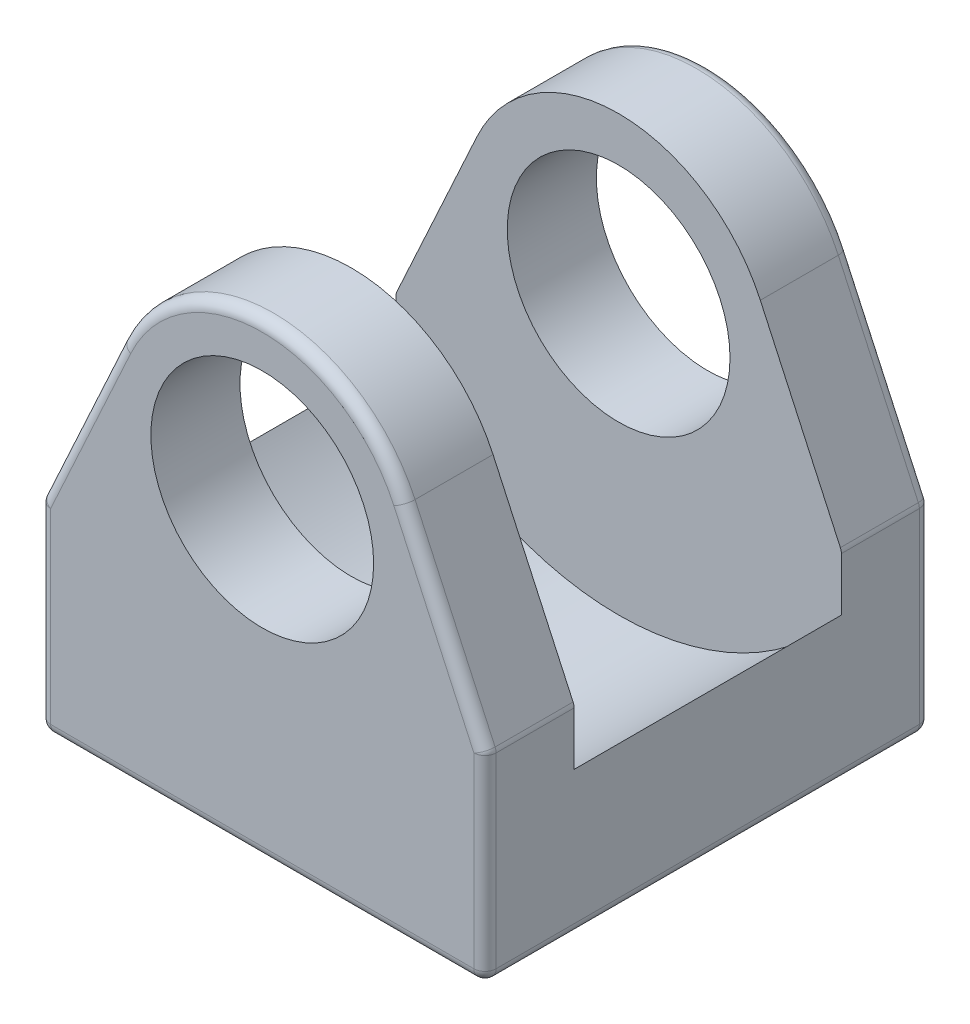
ISO-10303-21;
HEADER;
FILE_DESCRIPTION(('STEP AP214'),'2;1');
FILE_NAME('part.step','',(''),(''),'','','');
FILE_SCHEMA(('AUTOMOTIVE_DESIGN { 1 0 10303 214 1 1 1 1 }'));
ENDSEC;
DATA;
#1=APPLICATION_CONTEXT('core data for automotive mechanical design processes');
#2=APPLICATION_PROTOCOL_DEFINITION('international standard','automotive_design',2000,#1);
#3=PRODUCT_CONTEXT('',#1,'mechanical');
#4=PRODUCT('Part','Part','',(#3));
#5=PRODUCT_RELATED_PRODUCT_CATEGORY('part','',(#4));
#6=PRODUCT_DEFINITION_FORMATION('','',#4);
#7=PRODUCT_DEFINITION_CONTEXT('part definition',#1,'design');
#8=PRODUCT_DEFINITION('design','',#6,#7);
#9=PRODUCT_DEFINITION_SHAPE('','',#8);
#10=(LENGTH_UNIT() NAMED_UNIT(*) SI_UNIT(.MILLI.,.METRE.));
#11=(NAMED_UNIT(*) PLANE_ANGLE_UNIT() SI_UNIT($,.RADIAN.));
#12=(NAMED_UNIT(*) SI_UNIT($,.STERADIAN.) SOLID_ANGLE_UNIT());
#13=UNCERTAINTY_MEASURE_WITH_UNIT(LENGTH_MEASURE(1.E-05),#10,'distance_accuracy_value','');
#14=(GEOMETRIC_REPRESENTATION_CONTEXT(3) GLOBAL_UNCERTAINTY_ASSIGNED_CONTEXT((#13)) GLOBAL_UNIT_ASSIGNED_CONTEXT((#10,
#11,#12)) REPRESENTATION_CONTEXT('',''));
#15=CARTESIAN_POINT('',(0.,0.,0.));
#16=DIRECTION('',(0.,0.,1.));
#17=DIRECTION('',(1.,0.,0.));
#18=AXIS2_PLACEMENT_3D('',#15,#16,#17);
#19=CARTESIAN_POINT('',(10.,4.5,10.));
#20=DIRECTION('',(-1.,0.,0.));
#21=DIRECTION('',(0.,-1.,0.));
#22=AXIS2_PLACEMENT_3D('',#19,#20,#21);
#23=PLANE('',#22);
#24=DIRECTION('',(0.,1.,0.));
#25=VECTOR('',#24,1.);
#26=CARTESIAN_POINT('',(10.,4.5,-6.));
#27=LINE('',#26,#25);
#28=CARTESIAN_POINT('',(10.,1.99999999999999,-6.));
#29=VERTEX_POINT('',#28);
#30=CARTESIAN_POINT('',(10.,4.39065300332114,-6.));
#31=VERTEX_POINT('',#30);
#32=EDGE_CURVE('E243',#29,#31,#27,.T.);
#33=ORIENTED_EDGE('',*,*,#32,.F.);
#34=DIRECTION('',(0.,0.,1.));
#35=VECTOR('',#34,1.);
#36=CARTESIAN_POINT('',(10.,1.99999999999999,-6.));
#37=LINE('',#36,#35);
#38=CARTESIAN_POINT('',(10.,1.99999999999999,6.));
#39=VERTEX_POINT('',#38);
#40=EDGE_CURVE('E248',#29,#39,#37,.T.);
#41=ORIENTED_EDGE('',*,*,#40,.T.);
#42=DIRECTION('',(0.,1.,0.));
#43=VECTOR('',#42,1.);
#44=CARTESIAN_POINT('',(10.,4.5,6.));
#45=LINE('',#44,#43);
#46=CARTESIAN_POINT('',(10.,4.39065300332114,6.));
#47=VERTEX_POINT('',#46);
#48=EDGE_CURVE('E208',#39,#47,#45,.T.);
#49=ORIENTED_EDGE('',*,*,#48,.T.);
#50=DIRECTION('',(0.,0.,-1.));
#51=VECTOR('',#50,1.);
#52=CARTESIAN_POINT('',(10.,4.39065300332114,10.));
#53=LINE('',#52,#51);
#54=CARTESIAN_POINT('',(10.,4.39065300332114,9.5));
#55=VERTEX_POINT('',#54);
#56=EDGE_CURVE('E311',#47,#55,#53,.F.);
#57=ORIENTED_EDGE('',*,*,#56,.T.);
#58=DIRECTION('',(0.,1.,0.));
#59=VECTOR('',#58,1.);
#60=CARTESIAN_POINT('',(10.,-4.5,9.5));
#61=LINE('',#60,#59);
#62=CARTESIAN_POINT('',(10.,-4.,9.5));
#63=VERTEX_POINT('',#62);
#64=EDGE_CURVE('E315',#55,#63,#61,.F.);
#65=ORIENTED_EDGE('',*,*,#64,.T.);
#66=DIRECTION('',(0.,0.,-1.));
#67=VECTOR('',#66,1.);
#68=CARTESIAN_POINT('',(10.,-4.,10.));
#69=LINE('',#68,#67);
#70=CARTESIAN_POINT('',(10.,-4.,-9.5));
#71=VERTEX_POINT('',#70);
#72=EDGE_CURVE('E307',#63,#71,#69,.T.);
#73=ORIENTED_EDGE('',*,*,#72,.T.);
#74=DIRECTION('',(0.,1.,0.));
#75=VECTOR('',#74,1.);
#76=CARTESIAN_POINT('',(10.,4.5,-9.5));
#77=LINE('',#76,#75);
#78=CARTESIAN_POINT('',(10.,4.39065300332114,-9.5));
#79=VERTEX_POINT('',#78);
#80=EDGE_CURVE('E309',#71,#79,#77,.T.);
#81=ORIENTED_EDGE('',*,*,#80,.T.);
#82=EDGE_CURVE('E312',#79,#31,#53,.F.);
#83=ORIENTED_EDGE('',*,*,#82,.T.);
#84=EDGE_LOOP('',(#33,#41,#49,#57,#65,#73,#81,#83));
#85=FACE_BOUND('',#84,.T.);
#86=ADVANCED_FACE('F36',(#85),#23,.F.);
#87=CARTESIAN_POINT('',(6.36098340838278,12.4219668167656,10.));
#88=DIRECTION('',(-0.908711915483254,-0.417423830966507,0.));
#89=DIRECTION('',(0.417423830966507,-0.908711915483254,0.));
#90=AXIS2_PLACEMENT_3D('',#87,#88,#89);
#91=PLANE('',#90);
#92=DIRECTION('',(-0.417423830966507,0.908711915483254,0.));
#93=VECTOR('',#92,1.);
#94=CARTESIAN_POINT('',(6.36098340838278,12.4219668167656,-6.));
#95=LINE('',#94,#93);
#96=CARTESIAN_POINT('',(9.95435595774162,4.59936491880439,-6.));
#97=VERTEX_POINT('',#96);
#98=CARTESIAN_POINT('',(6.36098340838278,12.4219668167656,-6.));
#99=VERTEX_POINT('',#98);
#100=EDGE_CURVE('E238',#97,#99,#95,.T.);
#101=ORIENTED_EDGE('',*,*,#100,.F.);
#102=DIRECTION('',(0.,0.,-1.));
#103=VECTOR('',#102,1.);
#104=CARTESIAN_POINT('',(9.95435595774162,4.59936491880439,10.));
#105=LINE('',#104,#103);
#106=CARTESIAN_POINT('',(9.95435595774162,4.59936491880439,-9.5));
#107=VERTEX_POINT('',#106);
#108=EDGE_CURVE('E298',#97,#107,#105,.T.);
#109=ORIENTED_EDGE('',*,*,#108,.T.);
#110=DIRECTION('',(-0.417423830966507,0.908711915483254,0.));
#111=VECTOR('',#110,1.);
#112=CARTESIAN_POINT('',(6.36098340838278,12.4219668167656,-9.5));
#113=LINE('',#112,#111);
#114=CARTESIAN_POINT('',(6.36098340838278,12.4219668167656,-9.5));
#115=VERTEX_POINT('',#114);
#116=EDGE_CURVE('E302',#107,#115,#113,.T.);
#117=ORIENTED_EDGE('',*,*,#116,.T.);
#118=DIRECTION('',(0.,0.,-1.));
#119=VECTOR('',#118,1.);
#120=CARTESIAN_POINT('',(6.36098340838278,12.4219668167656,10.));
#121=LINE('',#120,#119);
#122=EDGE_CURVE('E262',#99,#115,#121,.T.);
#123=ORIENTED_EDGE('',*,*,#122,.F.);
#124=EDGE_LOOP('',(#101,#109,#117,#123));
#125=FACE_BOUND('',#124,.T.);
#126=ADVANCED_FACE('F461',(#125),#91,.F.);
#127=CARTESIAN_POINT('',(0.,9.5,10.));
#128=DIRECTION('',(0.,0.,-1.));
#129=DIRECTION('',(-1.,0.,0.));
#130=AXIS2_PLACEMENT_3D('',#127,#128,#129);
#131=CYLINDRICAL_SURFACE('',#130,7.);
#132=CARTESIAN_POINT('',(0.,9.5,-6.));
#133=DIRECTION('',(0.,0.,1.));
#134=DIRECTION('',(1.,0.,0.));
#135=AXIS2_PLACEMENT_3D('',#132,#133,#134);
#136=CIRCLE('',#135,7.);
#137=CARTESIAN_POINT('',(-6.36098340838278,12.4219668167656,-6.));
#138=VERTEX_POINT('',#137);
#139=EDGE_CURVE('E236',#99,#138,#136,.T.);
#140=ORIENTED_EDGE('',*,*,#139,.F.);
#141=ORIENTED_EDGE('',*,*,#122,.T.);
#142=CARTESIAN_POINT('',(0.,9.5,-9.5));
#143=DIRECTION('',(0.,0.,1.));
#144=DIRECTION('',(1.,0.,0.));
#145=AXIS2_PLACEMENT_3D('',#142,#143,#144);
#146=CIRCLE('',#145,7.);
#147=CARTESIAN_POINT('',(-6.36098340838278,12.4219668167656,-9.5));
#148=VERTEX_POINT('',#147);
#149=EDGE_CURVE('E279',#115,#148,#146,.T.);
#150=ORIENTED_EDGE('',*,*,#149,.T.);
#151=DIRECTION('',(0.,0.,-1.));
#152=VECTOR('',#151,1.);
#153=CARTESIAN_POINT('',(-6.36098340838278,12.4219668167656,10.));
#154=LINE('',#153,#152);
#155=EDGE_CURVE('E254',#138,#148,#154,.T.);
#156=ORIENTED_EDGE('',*,*,#155,.F.);
#157=EDGE_LOOP('',(#140,#141,#150,#156));
#158=FACE_BOUND('',#157,.T.);
#159=ADVANCED_FACE('F465',(#158),#131,.T.);
#160=CARTESIAN_POINT('',(-10.,4.5,10.));
#161=DIRECTION('',(0.908711915483254,-0.417423830966508,0.));
#162=DIRECTION('',(0.417423830966508,0.908711915483254,0.));
#163=AXIS2_PLACEMENT_3D('',#160,#161,#162);
#164=PLANE('',#163);
#165=DIRECTION('',(-0.417423830966508,-0.908711915483254,0.));
#166=VECTOR('',#165,1.);
#167=CARTESIAN_POINT('',(-10.,4.5,-6.));
#168=LINE('',#167,#166);
#169=CARTESIAN_POINT('',(-9.95435595774163,4.59936491880439,-6.));
#170=VERTEX_POINT('',#169);
#171=EDGE_CURVE('E234',#138,#170,#168,.T.);
#172=ORIENTED_EDGE('',*,*,#171,.F.);
#173=ORIENTED_EDGE('',*,*,#155,.T.);
#174=DIRECTION('',(-0.417423830966508,-0.908711915483254,0.));
#175=VECTOR('',#174,1.);
#176=CARTESIAN_POINT('',(-10.,4.5,-9.5));
#177=LINE('',#176,#175);
#178=CARTESIAN_POINT('',(-9.95435595774163,4.59936491880439,-9.5));
#179=VERTEX_POINT('',#178);
#180=EDGE_CURVE('E335',#148,#179,#177,.T.);
#181=ORIENTED_EDGE('',*,*,#180,.T.);
#182=DIRECTION('',(0.,0.,-1.));
#183=VECTOR('',#182,1.);
#184=CARTESIAN_POINT('',(-9.95435595774163,4.59936491880439,10.));
#185=LINE('',#184,#183);
#186=EDGE_CURVE('E337',#179,#170,#185,.F.);
#187=ORIENTED_EDGE('',*,*,#186,.T.);
#188=EDGE_LOOP('',(#172,#173,#181,#187));
#189=FACE_BOUND('',#188,.T.);
#190=ADVANCED_FACE('F428',(#189),#164,.F.);
#191=CARTESIAN_POINT('',(-10.,4.5,10.));
#192=DIRECTION('',(1.,0.,0.));
#193=DIRECTION('',(0.,1.,0.));
#194=AXIS2_PLACEMENT_3D('',#191,#192,#193);
#195=PLANE('',#194);
#196=DIRECTION('',(0.,-1.,0.));
#197=VECTOR('',#196,1.);
#198=CARTESIAN_POINT('',(-10.,4.5,-6.));
#199=LINE('',#198,#197);
#200=CARTESIAN_POINT('',(-10.,4.39065300332114,-6.));
#201=VERTEX_POINT('',#200);
#202=CARTESIAN_POINT('',(-10.,2.,-6.));
#203=VERTEX_POINT('',#202);
#204=EDGE_CURVE('E232',#201,#203,#199,.T.);
#205=ORIENTED_EDGE('',*,*,#204,.F.);
#206=DIRECTION('',(0.,0.,-1.));
#207=VECTOR('',#206,1.);
#208=CARTESIAN_POINT('',(-10.,4.39065300332114,10.));
#209=LINE('',#208,#207);
#210=CARTESIAN_POINT('',(-10.,4.39065300332114,-9.5));
#211=VERTEX_POINT('',#210);
#212=EDGE_CURVE('E327',#201,#211,#209,.T.);
#213=ORIENTED_EDGE('',*,*,#212,.T.);
#214=DIRECTION('',(0.,-1.,0.));
#215=VECTOR('',#214,1.);
#216=CARTESIAN_POINT('',(-10.,4.5,-9.5));
#217=LINE('',#216,#215);
#218=CARTESIAN_POINT('',(-10.,-4.,-9.5));
#219=VERTEX_POINT('',#218);
#220=EDGE_CURVE('E329',#211,#219,#217,.T.);
#221=ORIENTED_EDGE('',*,*,#220,.T.);
#222=DIRECTION('',(0.,0.,-1.));
#223=VECTOR('',#222,1.);
#224=CARTESIAN_POINT('',(-10.,-4.,10.));
#225=LINE('',#224,#223);
#226=CARTESIAN_POINT('',(-10.,-4.,9.5));
#227=VERTEX_POINT('',#226);
#228=EDGE_CURVE('E331',#219,#227,#225,.F.);
#229=ORIENTED_EDGE('',*,*,#228,.T.);
#230=DIRECTION('',(0.,-1.,0.));
#231=VECTOR('',#230,1.);
#232=CARTESIAN_POINT('',(-10.,4.5,9.5));
#233=LINE('',#232,#231);
#234=CARTESIAN_POINT('',(-10.,4.39065300332114,9.5));
#235=VERTEX_POINT('',#234);
#236=EDGE_CURVE('E333',#227,#235,#233,.F.);
#237=ORIENTED_EDGE('',*,*,#236,.T.);
#238=CARTESIAN_POINT('',(-10.,4.39065300332114,6.));
#239=VERTEX_POINT('',#238);
#240=EDGE_CURVE('E214',#235,#239,#209,.T.);
#241=ORIENTED_EDGE('',*,*,#240,.T.);
#242=DIRECTION('',(0.,-1.,0.));
#243=VECTOR('',#242,1.);
#244=CARTESIAN_POINT('',(-10.,4.5,6.));
#245=LINE('',#244,#243);
#246=CARTESIAN_POINT('',(-10.,2.,6.));
#247=VERTEX_POINT('',#246);
#248=EDGE_CURVE('E51',#239,#247,#245,.T.);
#249=ORIENTED_EDGE('',*,*,#248,.T.);
#250=DIRECTION('',(0.,0.,1.));
#251=VECTOR('',#250,1.);
#252=CARTESIAN_POINT('',(-10.,2.,-6.));
#253=LINE('',#252,#251);
#254=EDGE_CURVE('E11',#247,#203,#253,.F.);
#255=ORIENTED_EDGE('',*,*,#254,.T.);
#256=EDGE_LOOP('',(#205,#213,#221,#229,#237,#241,#249,#255));
#257=FACE_BOUND('',#256,.T.);
#258=ADVANCED_FACE('F211',(#257),#195,.F.);
#259=CARTESIAN_POINT('',(0.,9.5,10.));
#260=DIRECTION('',(0.,0.,-1.));
#261=DIRECTION('',(-1.,0.,0.));
#262=AXIS2_PLACEMENT_3D('',#259,#260,#261);
#263=CYLINDRICAL_SURFACE('',#262,5.);
#264=CARTESIAN_POINT('',(0.,9.5,-10.));
#265=DIRECTION('',(0.,0.,1.));
#266=DIRECTION('',(1.,0.,0.));
#267=AXIS2_PLACEMENT_3D('',#264,#265,#266);
#268=CIRCLE('',#267,5.);
#269=CARTESIAN_POINT('',(5.,9.5,-10.));
#270=VERTEX_POINT('',#269);
#271=EDGE_CURVE('E255',#270,#270,#268,.T.);
#272=ORIENTED_EDGE('',*,*,#271,.F.);
#273=EDGE_LOOP('',(#272));
#274=FACE_BOUND('',#273,.T.);
#275=CARTESIAN_POINT('',(0.,9.5,-6.));
#276=DIRECTION('',(0.,0.,1.));
#277=DIRECTION('',(1.,0.,0.));
#278=AXIS2_PLACEMENT_3D('',#275,#276,#277);
#279=CIRCLE('',#278,5.);
#280=CARTESIAN_POINT('',(5.,9.5,-6.));
#281=VERTEX_POINT('',#280);
#282=EDGE_CURVE('E245',#281,#281,#279,.T.);
#283=ORIENTED_EDGE('',*,*,#282,.T.);
#284=EDGE_LOOP('',(#283));
#285=FACE_BOUND('',#284,.T.);
#286=ADVANCED_FACE('F738',(#274,#285),#263,.F.);
#287=CARTESIAN_POINT('',(9.5,4.39065300332114,10.));
#288=DIRECTION('',(0.,0.,-1.));
#289=DIRECTION('',(-1.,0.,0.));
#290=AXIS2_PLACEMENT_3D('',#287,#288,#289);
#291=CYLINDRICAL_SURFACE('',#290,0.5);
#292=ORIENTED_EDGE('',*,*,#108,.F.);
#293=CARTESIAN_POINT('',(9.5,4.39065300332114,-6.));
#294=DIRECTION('',(0.,0.,1.));
#295=DIRECTION('',(1.,0.,0.));
#296=AXIS2_PLACEMENT_3D('',#293,#294,#295);
#297=CIRCLE('',#296,0.5);
#298=EDGE_CURVE('E240',#97,#31,#297,.F.);
#299=ORIENTED_EDGE('',*,*,#298,.T.);
#300=ORIENTED_EDGE('',*,*,#82,.F.);
#301=CARTESIAN_POINT('',(9.5,4.39065300332114,-9.5));
#302=DIRECTION('',(0.,0.,-1.));
#303=DIRECTION('',(-1.,0.,0.));
#304=AXIS2_PLACEMENT_3D('',#301,#302,#303);
#305=CIRCLE('',#304,0.5);
#306=EDGE_CURVE('E371',#79,#107,#305,.F.);
#307=ORIENTED_EDGE('',*,*,#306,.T.);
#308=EDGE_LOOP('',(#292,#299,#300,#307));
#309=FACE_BOUND('',#308,.T.);
#310=ADVANCED_FACE('F455',(#309),#291,.T.);
#311=CARTESIAN_POINT('',(-9.5,4.39065300332114,10.));
#312=DIRECTION('',(0.,0.,-1.));
#313=DIRECTION('',(-1.,0.,0.));
#314=AXIS2_PLACEMENT_3D('',#311,#312,#313);
#315=CYLINDRICAL_SURFACE('',#314,0.5);
#316=ORIENTED_EDGE('',*,*,#212,.F.);
#317=CARTESIAN_POINT('',(-9.5,4.39065300332114,-6.));
#318=DIRECTION('',(0.,0.,1.));
#319=DIRECTION('',(1.,0.,0.));
#320=AXIS2_PLACEMENT_3D('',#317,#318,#319);
#321=CIRCLE('',#320,0.5);
#322=EDGE_CURVE('E44',#201,#170,#321,.F.);
#323=ORIENTED_EDGE('',*,*,#322,.T.);
#324=ORIENTED_EDGE('',*,*,#186,.F.);
#325=CARTESIAN_POINT('',(-9.5,4.39065300332114,-9.5));
#326=DIRECTION('',(0.,0.,-1.));
#327=DIRECTION('',(-1.,0.,0.));
#328=AXIS2_PLACEMENT_3D('',#325,#326,#327);
#329=CIRCLE('',#328,0.5);
#330=EDGE_CURVE('E363',#179,#211,#329,.F.);
#331=ORIENTED_EDGE('',*,*,#330,.T.);
#332=EDGE_LOOP('',(#316,#323,#324,#331));
#333=FACE_BOUND('',#332,.T.);
#334=ADVANCED_FACE('F424',(#333),#315,.T.);
#335=CARTESIAN_POINT('',(0.,9.5,10.));
#336=DIRECTION('',(0.,0.,1.));
#337=DIRECTION('',(1.,0.,0.));
#338=AXIS2_PLACEMENT_3D('',#335,#336,#337);
#339=PLANE('',#338);
#340=DIRECTION('',(-0.417423830966507,0.908711915483254,0.));
#341=VECTOR('',#340,1.);
#342=CARTESIAN_POINT('',(5.90662745064115,12.2132549012823,10.));
#343=LINE('',#342,#341);
#344=CARTESIAN_POINT('',(9.5,4.39065300332114,10.));
#345=VERTEX_POINT('',#344);
#346=CARTESIAN_POINT('',(5.90662745064115,12.2132549012823,10.));
#347=VERTEX_POINT('',#346);
#348=EDGE_CURVE('E274',#345,#347,#343,.T.);
#349=ORIENTED_EDGE('',*,*,#348,.T.);
#350=CARTESIAN_POINT('',(0.,9.5,10.));
#351=DIRECTION('',(0.,0.,1.));
#352=DIRECTION('',(1.,0.,0.));
#353=AXIS2_PLACEMENT_3D('',#350,#351,#352);
#354=CIRCLE('',#353,6.5);
#355=CARTESIAN_POINT('',(-5.90662745064115,12.2132549012823,10.));
#356=VERTEX_POINT('',#355);
#357=EDGE_CURVE('E276',#347,#356,#354,.T.);
#358=ORIENTED_EDGE('',*,*,#357,.T.);
#359=DIRECTION('',(-0.417423830966508,-0.908711915483254,0.));
#360=VECTOR('',#359,1.);
#361=CARTESIAN_POINT('',(-9.54564404225838,4.29128808451674,10.));
#362=LINE('',#361,#360);
#363=CARTESIAN_POINT('',(-9.5,4.39065300332114,10.));
#364=VERTEX_POINT('',#363);
#365=EDGE_CURVE('E266',#356,#364,#362,.T.);
#366=ORIENTED_EDGE('',*,*,#365,.T.);
#367=DIRECTION('',(0.,-1.,0.));
#368=VECTOR('',#367,1.);
#369=CARTESIAN_POINT('',(-9.5,-4.5,10.));
#370=LINE('',#369,#368);
#371=CARTESIAN_POINT('',(-9.5,-4.,10.));
#372=VERTEX_POINT('',#371);
#373=EDGE_CURVE('E268',#364,#372,#370,.T.);
#374=ORIENTED_EDGE('',*,*,#373,.T.);
#375=DIRECTION('',(1.,0.,0.));
#376=VECTOR('',#375,1.);
#377=CARTESIAN_POINT('',(10.,-4.,10.));
#378=LINE('',#377,#376);
#379=CARTESIAN_POINT('',(9.5,-4.,10.));
#380=VERTEX_POINT('',#379);
#381=EDGE_CURVE('E270',#372,#380,#378,.T.);
#382=ORIENTED_EDGE('',*,*,#381,.T.);
#383=DIRECTION('',(0.,1.,0.));
#384=VECTOR('',#383,1.);
#385=CARTESIAN_POINT('',(9.5,4.5,10.));
#386=LINE('',#385,#384);
#387=EDGE_CURVE('E272',#380,#345,#386,.T.);
#388=ORIENTED_EDGE('',*,*,#387,.T.);
#389=EDGE_LOOP('',(#349,#358,#366,#374,#382,#388));
#390=FACE_BOUND('',#389,.T.);
#391=CARTESIAN_POINT('',(0.,9.5,10.));
#392=DIRECTION('',(0.,0.,1.));
#393=DIRECTION('',(1.,0.,0.));
#394=AXIS2_PLACEMENT_3D('',#391,#392,#393);
#395=CIRCLE('',#394,5.);
#396=CARTESIAN_POINT('',(5.,9.5,10.));
#397=VERTEX_POINT('',#396);
#398=EDGE_CURVE('E251',#397,#397,#395,.T.);
#399=ORIENTED_EDGE('',*,*,#398,.F.);
#400=EDGE_LOOP('',(#399));
#401=FACE_BOUND('',#400,.T.);
#402=ADVANCED_FACE('F515',(#390,#401),#339,.T.);
#403=CARTESIAN_POINT('',(0.,9.5,-10.));
#404=DIRECTION('',(0.,0.,1.));
#405=DIRECTION('',(1.,0.,0.));
#406=AXIS2_PLACEMENT_3D('',#403,#404,#405);
#407=PLANE('',#406);
#408=DIRECTION('',(-0.417423830966508,-0.908711915483254,0.));
#409=VECTOR('',#408,1.);
#410=CARTESIAN_POINT('',(-5.90662745064115,12.2132549012823,-10.));
#411=LINE('',#410,#409);
#412=CARTESIAN_POINT('',(-9.5,4.39065300332113,-10.));
#413=VERTEX_POINT('',#412);
#414=CARTESIAN_POINT('',(-5.90662745064115,12.2132549012823,-10.));
#415=VERTEX_POINT('',#414);
#416=EDGE_CURVE('E285',#413,#415,#411,.F.);
#417=ORIENTED_EDGE('',*,*,#416,.T.);
#418=CARTESIAN_POINT('',(0.,9.5,-10.));
#419=DIRECTION('',(0.,0.,1.));
#420=DIRECTION('',(1.,0.,0.));
#421=AXIS2_PLACEMENT_3D('',#418,#419,#420);
#422=CIRCLE('',#421,6.5);
#423=CARTESIAN_POINT('',(5.90662745064115,12.2132549012823,-10.));
#424=VERTEX_POINT('',#423);
#425=EDGE_CURVE('E295',#415,#424,#422,.F.);
#426=ORIENTED_EDGE('',*,*,#425,.T.);
#427=DIRECTION('',(-0.417423830966507,0.908711915483254,0.));
#428=VECTOR('',#427,1.);
#429=CARTESIAN_POINT('',(5.90662745064115,12.2132549012823,-10.));
#430=LINE('',#429,#428);
#431=CARTESIAN_POINT('',(9.5,4.39065300332114,-10.));
#432=VERTEX_POINT('',#431);
#433=EDGE_CURVE('E293',#424,#432,#430,.F.);
#434=ORIENTED_EDGE('',*,*,#433,.T.);
#435=DIRECTION('',(0.,1.,0.));
#436=VECTOR('',#435,1.);
#437=CARTESIAN_POINT('',(9.49999999999999,9.5,-10.));
#438=LINE('',#437,#436);
#439=CARTESIAN_POINT('',(9.5,-4.,-10.));
#440=VERTEX_POINT('',#439);
#441=EDGE_CURVE('E291',#432,#440,#438,.F.);
#442=ORIENTED_EDGE('',*,*,#441,.T.);
#443=DIRECTION('',(1.,0.,0.));
#444=VECTOR('',#443,1.);
#445=CARTESIAN_POINT('',(0.,-4.,-10.));
#446=LINE('',#445,#444);
#447=CARTESIAN_POINT('',(-9.5,-4.,-10.));
#448=VERTEX_POINT('',#447);
#449=EDGE_CURVE('E289',#440,#448,#446,.F.);
#450=ORIENTED_EDGE('',*,*,#449,.T.);
#451=DIRECTION('',(0.,-1.,0.));
#452=VECTOR('',#451,1.);
#453=CARTESIAN_POINT('',(-9.50000000000001,9.5,-10.));
#454=LINE('',#453,#452);
#455=EDGE_CURVE('E287',#448,#413,#454,.F.);
#456=ORIENTED_EDGE('',*,*,#455,.T.);
#457=EDGE_LOOP('',(#417,#426,#434,#442,#450,#456));
#458=FACE_BOUND('',#457,.T.);
#459=ORIENTED_EDGE('',*,*,#271,.T.);
#460=EDGE_LOOP('',(#459));
#461=FACE_BOUND('',#460,.T.);
#462=ADVANCED_FACE('F472',(#458,#461),#407,.F.);
#463=CARTESIAN_POINT('',(9.95435595774162,4.59936491880439,9.5));
#464=VERTEX_POINT('',#463);
#465=CARTESIAN_POINT('',(9.95435595774162,4.59936491880439,6.));
#466=VERTEX_POINT('',#465);
#467=EDGE_CURVE('E299',#464,#466,#105,.T.);
#468=ORIENTED_EDGE('',*,*,#467,.T.);
#469=DIRECTION('',(-0.417423830966507,0.908711915483254,0.));
#470=VECTOR('',#469,1.);
#471=CARTESIAN_POINT('',(6.36098340838278,12.4219668167656,6.));
#472=LINE('',#471,#470);
#473=CARTESIAN_POINT('',(6.36098340838278,12.4219668167656,6.));
#474=VERTEX_POINT('',#473);
#475=EDGE_CURVE('E223',#466,#474,#472,.T.);
#476=ORIENTED_EDGE('',*,*,#475,.T.);
#477=CARTESIAN_POINT('',(6.36098340838278,12.4219668167656,9.5));
#478=VERTEX_POINT('',#477);
#479=EDGE_CURVE('E263',#478,#474,#121,.T.);
#480=ORIENTED_EDGE('',*,*,#479,.F.);
#481=DIRECTION('',(-0.417423830966507,0.908711915483254,0.));
#482=VECTOR('',#481,1.);
#483=CARTESIAN_POINT('',(10.,4.5,9.5));
#484=LINE('',#483,#482);
#485=EDGE_CURVE('E305',#478,#464,#484,.F.);
#486=ORIENTED_EDGE('',*,*,#485,.T.);
#487=EDGE_LOOP('',(#468,#476,#480,#486));
#488=FACE_BOUND('',#487,.T.);
#489=ADVANCED_FACE('F525',(#488),#91,.F.);
#490=ORIENTED_EDGE('',*,*,#479,.T.);
#491=CARTESIAN_POINT('',(0.,9.5,6.));
#492=DIRECTION('',(0.,0.,1.));
#493=DIRECTION('',(1.,0.,0.));
#494=AXIS2_PLACEMENT_3D('',#491,#492,#493);
#495=CIRCLE('',#494,7.);
#496=CARTESIAN_POINT('',(-6.36098340838278,12.4219668167656,6.));
#497=VERTEX_POINT('',#496);
#498=EDGE_CURVE('E217',#474,#497,#495,.T.);
#499=ORIENTED_EDGE('',*,*,#498,.T.);
#500=CARTESIAN_POINT('',(-6.36098340838278,12.4219668167656,9.5));
#501=VERTEX_POINT('',#500);
#502=EDGE_CURVE('E259',#501,#497,#154,.T.);
#503=ORIENTED_EDGE('',*,*,#502,.F.);
#504=CARTESIAN_POINT('',(0.,9.5,9.5));
#505=DIRECTION('',(0.,0.,1.));
#506=DIRECTION('',(1.,0.,0.));
#507=AXIS2_PLACEMENT_3D('',#504,#505,#506);
#508=CIRCLE('',#507,7.);
#509=EDGE_CURVE('E282',#501,#478,#508,.F.);
#510=ORIENTED_EDGE('',*,*,#509,.T.);
#511=EDGE_LOOP('',(#490,#499,#503,#510));
#512=FACE_BOUND('',#511,.T.);
#513=ADVANCED_FACE('F503',(#512),#131,.T.);
#514=ORIENTED_EDGE('',*,*,#502,.T.);
#515=DIRECTION('',(-0.417423830966508,-0.908711915483254,0.));
#516=VECTOR('',#515,1.);
#517=CARTESIAN_POINT('',(-10.,4.5,6.));
#518=LINE('',#517,#516);
#519=CARTESIAN_POINT('',(-9.95435595774163,4.59936491880439,6.));
#520=VERTEX_POINT('',#519);
#521=EDGE_CURVE('E215',#497,#520,#518,.T.);
#522=ORIENTED_EDGE('',*,*,#521,.T.);
#523=CARTESIAN_POINT('',(-9.95435595774163,4.59936491880439,9.5));
#524=VERTEX_POINT('',#523);
#525=EDGE_CURVE('E59',#520,#524,#185,.F.);
#526=ORIENTED_EDGE('',*,*,#525,.T.);
#527=DIRECTION('',(-0.417423830966508,-0.908711915483254,0.));
#528=VECTOR('',#527,1.);
#529=CARTESIAN_POINT('',(-6.36098340838278,12.4219668167656,9.5));
#530=LINE('',#529,#528);
#531=EDGE_CURVE('E340',#524,#501,#530,.F.);
#532=ORIENTED_EDGE('',*,*,#531,.T.);
#533=EDGE_LOOP('',(#514,#522,#526,#532));
#534=FACE_BOUND('',#533,.T.);
#535=ADVANCED_FACE('F498',(#534),#164,.F.);
#536=CARTESIAN_POINT('',(-10.,-4.5,10.));
#537=DIRECTION('',(0.,1.,0.));
#538=DIRECTION('',(0.,0.,1.));
#539=AXIS2_PLACEMENT_3D('',#536,#537,#538);
#540=PLANE('',#539);
#541=DIRECTION('',(0.,0.,-1.));
#542=VECTOR('',#541,1.);
#543=CARTESIAN_POINT('',(9.5,-4.5,10.));
#544=LINE('',#543,#542);
#545=CARTESIAN_POINT('',(9.5,-4.5,-9.5));
#546=VERTEX_POINT('',#545);
#547=CARTESIAN_POINT('',(9.5,-4.5,9.5));
#548=VERTEX_POINT('',#547);
#549=EDGE_CURVE('E322',#546,#548,#544,.F.);
#550=ORIENTED_EDGE('',*,*,#549,.T.);
#551=DIRECTION('',(1.,0.,0.));
#552=VECTOR('',#551,1.);
#553=CARTESIAN_POINT('',(-10.,-4.5,9.5));
#554=LINE('',#553,#552);
#555=CARTESIAN_POINT('',(-9.5,-4.5,9.5));
#556=VERTEX_POINT('',#555);
#557=EDGE_CURVE('E324',#548,#556,#554,.F.);
#558=ORIENTED_EDGE('',*,*,#557,.T.);
#559=DIRECTION('',(0.,0.,-1.));
#560=VECTOR('',#559,1.);
#561=CARTESIAN_POINT('',(-9.5,-4.5,10.));
#562=LINE('',#561,#560);
#563=CARTESIAN_POINT('',(-9.5,-4.5,-9.5));
#564=VERTEX_POINT('',#563);
#565=EDGE_CURVE('E318',#556,#564,#562,.T.);
#566=ORIENTED_EDGE('',*,*,#565,.T.);
#567=DIRECTION('',(1.,0.,0.));
#568=VECTOR('',#567,1.);
#569=CARTESIAN_POINT('',(-10.,-4.5,-9.5));
#570=LINE('',#569,#568);
#571=EDGE_CURVE('E320',#564,#546,#570,.T.);
#572=ORIENTED_EDGE('',*,*,#571,.T.);
#573=EDGE_LOOP('',(#550,#558,#566,#572));
#574=FACE_BOUND('',#573,.T.);
#575=ADVANCED_FACE('F836',(#574),#540,.F.);
#576=CARTESIAN_POINT('',(0.,9.5,6.));
#577=DIRECTION('',(0.,0.,1.));
#578=DIRECTION('',(1.,0.,0.));
#579=AXIS2_PLACEMENT_3D('',#576,#577,#578);
#580=CIRCLE('',#579,5.);
#581=CARTESIAN_POINT('',(5.,9.5,6.));
#582=VERTEX_POINT('',#581);
#583=EDGE_CURVE('E229',#582,#582,#580,.T.);
#584=ORIENTED_EDGE('',*,*,#583,.F.);
#585=EDGE_LOOP('',(#584));
#586=FACE_BOUND('',#585,.T.);
#587=ORIENTED_EDGE('',*,*,#398,.T.);
#588=EDGE_LOOP('',(#587));
#589=FACE_BOUND('',#588,.T.);
#590=ADVANCED_FACE('F748',(#586,#589),#263,.F.);
#591=CARTESIAN_POINT('',(-10.,-4.,-9.5));
#592=DIRECTION('',(1.,0.,0.));
#593=DIRECTION('',(0.,0.,-1.));
#594=AXIS2_PLACEMENT_3D('',#591,#592,#593);
#595=CYLINDRICAL_SURFACE('',#594,0.5);
#596=CARTESIAN_POINT('',(9.5,-4.,-9.5));
#597=DIRECTION('',(1.,0.,0.));
#598=DIRECTION('',(0.,0.,-1.));
#599=AXIS2_PLACEMENT_3D('',#596,#597,#598);
#600=CIRCLE('',#599,0.5);
#601=EDGE_CURVE('E258',#546,#440,#600,.T.);
#602=ORIENTED_EDGE('',*,*,#601,.F.);
#603=ORIENTED_EDGE('',*,*,#571,.F.);
#604=CARTESIAN_POINT('',(-9.5,-4.,-9.5));
#605=DIRECTION('',(-1.,0.,0.));
#606=DIRECTION('',(0.,0.,1.));
#607=AXIS2_PLACEMENT_3D('',#604,#605,#606);
#608=CIRCLE('',#607,0.5);
#609=EDGE_CURVE('E415',#448,#564,#608,.T.);
#610=ORIENTED_EDGE('',*,*,#609,.F.);
#611=ORIENTED_EDGE('',*,*,#449,.F.);
#612=EDGE_LOOP('',(#602,#603,#610,#611));
#613=FACE_BOUND('',#612,.T.);
#614=ADVANCED_FACE('F38',(#613),#595,.T.);
#615=CARTESIAN_POINT('',(9.5,-4.,-9.5));
#616=DIRECTION('',(0.,0.,-1.));
#617=DIRECTION('',(-1.,0.,0.));
#618=AXIS2_PLACEMENT_3D('',#615,#616,#617);
#619=SPHERICAL_SURFACE('',#618,0.5);
#620=CARTESIAN_POINT('',(9.5,-4.,-9.5));
#621=DIRECTION('',(0.,0.,-1.));
#622=DIRECTION('',(-1.,0.,0.));
#623=AXIS2_PLACEMENT_3D('',#620,#621,#622);
#624=CIRCLE('',#623,0.5);
#625=EDGE_CURVE('E406',#546,#71,#624,.F.);
#626=ORIENTED_EDGE('',*,*,#625,.F.);
#627=ORIENTED_EDGE('',*,*,#601,.T.);
#628=CARTESIAN_POINT('',(9.5,-4.,-9.5));
#629=DIRECTION('',(0.,-1.,0.));
#630=DIRECTION('',(1.,0.,0.));
#631=AXIS2_PLACEMENT_3D('',#628,#629,#630);
#632=CIRCLE('',#631,0.5);
#633=EDGE_CURVE('E409',#71,#440,#632,.F.);
#634=ORIENTED_EDGE('',*,*,#633,.F.);
#635=EDGE_LOOP('',(#626,#627,#634));
#636=FACE_BOUND('',#635,.T.);
#637=ADVANCED_FACE('F545',(#636),#619,.T.);
#638=CARTESIAN_POINT('',(-9.5,-4.,-9.5));
#639=DIRECTION('',(0.,-1.,0.));
#640=DIRECTION('',(0.,0.,-1.));
#641=AXIS2_PLACEMENT_3D('',#638,#639,#640);
#642=SPHERICAL_SURFACE('',#641,0.5);
#643=CARTESIAN_POINT('',(-9.5,-4.,-9.5));
#644=DIRECTION('',(0.,-1.,0.));
#645=DIRECTION('',(0.,0.,-1.));
#646=AXIS2_PLACEMENT_3D('',#643,#644,#645);
#647=CIRCLE('',#646,0.5);
#648=EDGE_CURVE('E400',#448,#219,#647,.F.);
#649=ORIENTED_EDGE('',*,*,#648,.F.);
#650=ORIENTED_EDGE('',*,*,#609,.T.);
#651=CARTESIAN_POINT('',(-9.5,-4.,-9.5));
#652=DIRECTION('',(0.,0.,-1.));
#653=DIRECTION('',(-1.,0.,0.));
#654=AXIS2_PLACEMENT_3D('',#651,#652,#653);
#655=CIRCLE('',#654,0.5);
#656=EDGE_CURVE('E403',#219,#564,#655,.F.);
#657=ORIENTED_EDGE('',*,*,#656,.F.);
#658=EDGE_LOOP('',(#649,#650,#657));
#659=FACE_BOUND('',#658,.T.);
#660=ADVANCED_FACE('F481',(#659),#642,.T.);
#661=CARTESIAN_POINT('',(0.,9.5,-9.5));
#662=DIRECTION('',(0.,0.,1.));
#663=DIRECTION('',(1.,0.,0.));
#664=AXIS2_PLACEMENT_3D('',#661,#662,#663);
#665=TOROIDAL_SURFACE('',#664,6.5,0.5);
#666=CARTESIAN_POINT('',(-5.90662745064115,12.2132549012823,-9.5));
#667=DIRECTION('',(-0.417423830966508,-0.908711915483254,0.));
#668=DIRECTION('',(0.908711915483254,-0.417423830966508,0.));
#669=AXIS2_PLACEMENT_3D('',#666,#667,#668);
#670=CIRCLE('',#669,0.5);
#671=EDGE_CURVE('E397',#148,#415,#670,.T.);
#672=ORIENTED_EDGE('',*,*,#671,.F.);
#673=ORIENTED_EDGE('',*,*,#149,.F.);
#674=CARTESIAN_POINT('',(5.90662745064115,12.2132549012823,-9.5));
#675=DIRECTION('',(0.417423830966507,-0.908711915483254,0.));
#676=DIRECTION('',(0.908711915483254,0.417423830966507,0.));
#677=AXIS2_PLACEMENT_3D('',#674,#675,#676);
#678=CIRCLE('',#677,0.5);
#679=EDGE_CURVE('E412',#424,#115,#678,.T.);
#680=ORIENTED_EDGE('',*,*,#679,.F.);
#681=ORIENTED_EDGE('',*,*,#425,.F.);
#682=EDGE_LOOP('',(#672,#673,#680,#681));
#683=FACE_BOUND('',#682,.T.);
#684=ADVANCED_FACE('F470',(#683),#665,.T.);
#685=CARTESIAN_POINT('',(5.90662745064115,12.2132549012823,-9.5));
#686=DIRECTION('',(-0.417423830966507,0.908711915483254,0.));
#687=DIRECTION('',(-0.908711915483254,-0.417423830966507,0.));
#688=AXIS2_PLACEMENT_3D('',#685,#686,#687);
#689=CYLINDRICAL_SURFACE('',#688,0.5);
#690=ORIENTED_EDGE('',*,*,#679,.T.);
#691=ORIENTED_EDGE('',*,*,#116,.F.);
#692=CARTESIAN_POINT('',(9.5,4.39065300332114,-9.5));
#693=DIRECTION('',(0.417423830966507,-0.908711915483254,0.));
#694=DIRECTION('',(0.908711915483254,0.417423830966507,0.));
#695=AXIS2_PLACEMENT_3D('',#692,#693,#694);
#696=CIRCLE('',#695,0.5);
#697=EDGE_CURVE('E394',#432,#107,#696,.T.);
#698=ORIENTED_EDGE('',*,*,#697,.F.);
#699=ORIENTED_EDGE('',*,*,#433,.F.);
#700=EDGE_LOOP('',(#690,#691,#698,#699));
#701=FACE_BOUND('',#700,.T.);
#702=ADVANCED_FACE('F552',(#701),#689,.T.);
#703=CARTESIAN_POINT('',(9.5,4.5,-9.5));
#704=DIRECTION('',(0.,1.,0.));
#705=DIRECTION('',(-1.,0.,0.));
#706=AXIS2_PLACEMENT_3D('',#703,#704,#705);
#707=CYLINDRICAL_SURFACE('',#706,0.5);
#708=ORIENTED_EDGE('',*,*,#633,.T.);
#709=ORIENTED_EDGE('',*,*,#441,.F.);
#710=CARTESIAN_POINT('',(9.5,4.39065300332114,-9.5));
#711=DIRECTION('',(0.,1.,0.));
#712=DIRECTION('',(0.,0.,1.));
#713=AXIS2_PLACEMENT_3D('',#710,#711,#712);
#714=CIRCLE('',#713,0.5);
#715=EDGE_CURVE('E391',#79,#432,#714,.T.);
#716=ORIENTED_EDGE('',*,*,#715,.F.);
#717=ORIENTED_EDGE('',*,*,#80,.F.);
#718=EDGE_LOOP('',(#708,#709,#716,#717));
#719=FACE_BOUND('',#718,.T.);
#720=ADVANCED_FACE('F547',(#719),#707,.T.);
#721=CARTESIAN_POINT('',(9.5,-4.,10.));
#722=DIRECTION('',(0.,0.,-1.));
#723=DIRECTION('',(-1.,0.,0.));
#724=AXIS2_PLACEMENT_3D('',#721,#722,#723);
#725=CYLINDRICAL_SURFACE('',#724,0.5);
#726=ORIENTED_EDGE('',*,*,#625,.T.);
#727=ORIENTED_EDGE('',*,*,#72,.F.);
#728=CARTESIAN_POINT('',(9.5,-4.,9.5));
#729=DIRECTION('',(0.,0.,1.));
#730=DIRECTION('',(1.,0.,0.));
#731=AXIS2_PLACEMENT_3D('',#728,#729,#730);
#732=CIRCLE('',#731,0.5);
#733=EDGE_CURVE('E388',#548,#63,#732,.T.);
#734=ORIENTED_EDGE('',*,*,#733,.F.);
#735=ORIENTED_EDGE('',*,*,#549,.F.);
#736=EDGE_LOOP('',(#726,#727,#734,#735));
#737=FACE_BOUND('',#736,.T.);
#738=ADVANCED_FACE('F543',(#737),#725,.T.);
#739=CARTESIAN_POINT('',(0.,-4.,9.5));
#740=DIRECTION('',(-1.,0.,0.));
#741=DIRECTION('',(0.,0.,1.));
#742=AXIS2_PLACEMENT_3D('',#739,#740,#741);
#743=CYLINDRICAL_SURFACE('',#742,0.5);
#744=CARTESIAN_POINT('',(-9.5,-4.,9.5));
#745=DIRECTION('',(-1.,0.,0.));
#746=DIRECTION('',(0.,0.,1.));
#747=AXIS2_PLACEMENT_3D('',#744,#745,#746);
#748=CIRCLE('',#747,0.5);
#749=EDGE_CURVE('E382',#556,#372,#748,.T.);
#750=ORIENTED_EDGE('',*,*,#749,.F.);
#751=ORIENTED_EDGE('',*,*,#557,.F.);
#752=CARTESIAN_POINT('',(9.5,-4.,9.5));
#753=DIRECTION('',(1.,0.,0.));
#754=DIRECTION('',(0.,0.,-1.));
#755=AXIS2_PLACEMENT_3D('',#752,#753,#754);
#756=CIRCLE('',#755,0.5);
#757=EDGE_CURVE('E385',#380,#548,#756,.T.);
#758=ORIENTED_EDGE('',*,*,#757,.F.);
#759=ORIENTED_EDGE('',*,*,#381,.F.);
#760=EDGE_LOOP('',(#750,#751,#758,#759));
#761=FACE_BOUND('',#760,.T.);
#762=ADVANCED_FACE('F604',(#761),#743,.T.);
#763=CARTESIAN_POINT('',(-9.5,-4.,10.));
#764=DIRECTION('',(0.,0.,-1.));
#765=DIRECTION('',(-1.,0.,0.));
#766=AXIS2_PLACEMENT_3D('',#763,#764,#765);
#767=CYLINDRICAL_SURFACE('',#766,0.5);
#768=ORIENTED_EDGE('',*,*,#656,.T.);
#769=ORIENTED_EDGE('',*,*,#565,.F.);
#770=CARTESIAN_POINT('',(-9.5,-4.,9.5));
#771=DIRECTION('',(0.,0.,1.));
#772=DIRECTION('',(1.,0.,0.));
#773=AXIS2_PLACEMENT_3D('',#770,#771,#772);
#774=CIRCLE('',#773,0.5);
#775=EDGE_CURVE('E380',#227,#556,#774,.T.);
#776=ORIENTED_EDGE('',*,*,#775,.F.);
#777=ORIENTED_EDGE('',*,*,#228,.F.);
#778=EDGE_LOOP('',(#768,#769,#776,#777));
#779=FACE_BOUND('',#778,.T.);
#780=ADVANCED_FACE('F484',(#779),#767,.T.);
#781=CARTESIAN_POINT('',(-9.5,4.5,-9.5));
#782=DIRECTION('',(0.,-1.,0.));
#783=DIRECTION('',(1.,0.,0.));
#784=AXIS2_PLACEMENT_3D('',#781,#782,#783);
#785=CYLINDRICAL_SURFACE('',#784,0.5);
#786=ORIENTED_EDGE('',*,*,#648,.T.);
#787=ORIENTED_EDGE('',*,*,#220,.F.);
#788=CARTESIAN_POINT('',(-9.5,4.39065300332113,-9.5));
#789=DIRECTION('',(0.,1.,0.));
#790=DIRECTION('',(-1.,0.,0.));
#791=AXIS2_PLACEMENT_3D('',#788,#789,#790);
#792=CIRCLE('',#791,0.5);
#793=EDGE_CURVE('E377',#413,#211,#792,.T.);
#794=ORIENTED_EDGE('',*,*,#793,.F.);
#795=ORIENTED_EDGE('',*,*,#455,.F.);
#796=EDGE_LOOP('',(#786,#787,#794,#795));
#797=FACE_BOUND('',#796,.T.);
#798=ADVANCED_FACE('F442',(#797),#785,.T.);
#799=CARTESIAN_POINT('',(-9.54564404225838,4.29128808451675,-9.5));
#800=DIRECTION('',(-0.417423830966508,-0.908711915483254,0.));
#801=DIRECTION('',(0.908711915483254,-0.417423830966508,0.));
#802=AXIS2_PLACEMENT_3D('',#799,#800,#801);
#803=CYLINDRICAL_SURFACE('',#802,0.5);
#804=ORIENTED_EDGE('',*,*,#671,.T.);
#805=ORIENTED_EDGE('',*,*,#416,.F.);
#806=CARTESIAN_POINT('',(-9.5,4.39065300332114,-9.5));
#807=DIRECTION('',(-0.417423830966507,-0.908711915483254,0.));
#808=DIRECTION('',(0.908711915483254,-0.417423830966507,0.));
#809=AXIS2_PLACEMENT_3D('',#806,#807,#808);
#810=CIRCLE('',#809,0.5);
#811=EDGE_CURVE('E374',#179,#413,#810,.T.);
#812=ORIENTED_EDGE('',*,*,#811,.F.);
#813=ORIENTED_EDGE('',*,*,#180,.F.);
#814=EDGE_LOOP('',(#804,#805,#812,#813));
#815=FACE_BOUND('',#814,.T.);
#816=ADVANCED_FACE('F435',(#815),#803,.T.);
#817=CARTESIAN_POINT('',(9.5,4.39065300332114,-9.5));
#818=DIRECTION('',(0.,0.,-1.));
#819=DIRECTION('',(0.,1.,0.));
#820=AXIS2_PLACEMENT_3D('',#817,#818,#819);
#821=SPHERICAL_SURFACE('',#820,0.5);
#822=ORIENTED_EDGE('',*,*,#715,.T.);
#823=ORIENTED_EDGE('',*,*,#697,.T.);
#824=ORIENTED_EDGE('',*,*,#306,.F.);
#825=EDGE_LOOP('',(#822,#823,#824));
#826=FACE_BOUND('',#825,.T.);
#827=ADVANCED_FACE('F550',(#826),#821,.T.);
#828=CARTESIAN_POINT('',(9.5,-4.,9.5));
#829=DIRECTION('',(0.,-1.,0.));
#830=DIRECTION('',(0.,0.,-1.));
#831=AXIS2_PLACEMENT_3D('',#828,#829,#830);
#832=SPHERICAL_SURFACE('',#831,0.5);
#833=ORIENTED_EDGE('',*,*,#757,.T.);
#834=ORIENTED_EDGE('',*,*,#733,.T.);
#835=CARTESIAN_POINT('',(9.5,-4.,9.5));
#836=DIRECTION('',(0.,-1.,0.));
#837=DIRECTION('',(0.,0.,-1.));
#838=AXIS2_PLACEMENT_3D('',#835,#836,#837);
#839=CIRCLE('',#838,0.5);
#840=EDGE_CURVE('E369',#380,#63,#839,.F.);
#841=ORIENTED_EDGE('',*,*,#840,.F.);
#842=EDGE_LOOP('',(#833,#834,#841));
#843=FACE_BOUND('',#842,.T.);
#844=ADVANCED_FACE('F592',(#843),#832,.T.);
#845=CARTESIAN_POINT('',(-9.5,-4.,9.5));
#846=DIRECTION('',(0.,-1.,0.));
#847=DIRECTION('',(0.,0.,-1.));
#848=AXIS2_PLACEMENT_3D('',#845,#846,#847);
#849=SPHERICAL_SURFACE('',#848,0.5);
#850=ORIENTED_EDGE('',*,*,#775,.T.);
#851=ORIENTED_EDGE('',*,*,#749,.T.);
#852=CARTESIAN_POINT('',(-9.5,-4.,9.5));
#853=DIRECTION('',(0.,-1.,0.));
#854=DIRECTION('',(0.,0.,-1.));
#855=AXIS2_PLACEMENT_3D('',#852,#853,#854);
#856=CIRCLE('',#855,0.5);
#857=EDGE_CURVE('E366',#227,#372,#856,.F.);
#858=ORIENTED_EDGE('',*,*,#857,.F.);
#859=EDGE_LOOP('',(#850,#851,#858));
#860=FACE_BOUND('',#859,.T.);
#861=ADVANCED_FACE('F489',(#860),#849,.T.);
#862=CARTESIAN_POINT('',(-9.5,4.39065300332114,-9.5));
#863=DIRECTION('',(0.,0.,-1.));
#864=DIRECTION('',(0.,1.,0.));
#865=AXIS2_PLACEMENT_3D('',#862,#863,#864);
#866=SPHERICAL_SURFACE('',#865,0.5);
#867=ORIENTED_EDGE('',*,*,#811,.T.);
#868=ORIENTED_EDGE('',*,*,#793,.T.);
#869=ORIENTED_EDGE('',*,*,#330,.F.);
#870=EDGE_LOOP('',(#867,#868,#869));
#871=FACE_BOUND('',#870,.T.);
#872=ADVANCED_FACE('F438',(#871),#866,.T.);
#873=CARTESIAN_POINT('',(9.5,4.39065300332114,6.));
#874=DIRECTION('',(0.,0.,1.));
#875=DIRECTION('',(1.,0.,0.));
#876=AXIS2_PLACEMENT_3D('',#873,#874,#875);
#877=CIRCLE('',#876,0.5);
#878=EDGE_CURVE('E226',#466,#47,#877,.F.);
#879=ORIENTED_EDGE('',*,*,#878,.F.);
#880=ORIENTED_EDGE('',*,*,#467,.F.);
#881=CARTESIAN_POINT('',(9.5,4.39065300332114,9.5));
#882=DIRECTION('',(0.,0.,1.));
#883=DIRECTION('',(1.,0.,0.));
#884=AXIS2_PLACEMENT_3D('',#881,#882,#883);
#885=CIRCLE('',#884,0.5);
#886=EDGE_CURVE('E360',#55,#464,#885,.T.);
#887=ORIENTED_EDGE('',*,*,#886,.F.);
#888=ORIENTED_EDGE('',*,*,#56,.F.);
#889=EDGE_LOOP('',(#879,#880,#887,#888));
#890=FACE_BOUND('',#889,.T.);
#891=ADVANCED_FACE('F529',(#890),#291,.T.);
#892=CARTESIAN_POINT('',(9.49999999999999,9.5,9.5));
#893=DIRECTION('',(0.,-1.,0.));
#894=DIRECTION('',(1.,0.,0.));
#895=AXIS2_PLACEMENT_3D('',#892,#893,#894);
#896=CYLINDRICAL_SURFACE('',#895,0.5);
#897=ORIENTED_EDGE('',*,*,#840,.T.);
#898=ORIENTED_EDGE('',*,*,#64,.F.);
#899=CARTESIAN_POINT('',(9.5,4.39065300332114,9.5));
#900=DIRECTION('',(0.,1.,0.));
#901=DIRECTION('',(-1.,0.,0.));
#902=AXIS2_PLACEMENT_3D('',#899,#900,#901);
#903=CIRCLE('',#902,0.5);
#904=EDGE_CURVE('E357',#345,#55,#903,.T.);
#905=ORIENTED_EDGE('',*,*,#904,.F.);
#906=ORIENTED_EDGE('',*,*,#387,.F.);
#907=EDGE_LOOP('',(#897,#898,#905,#906));
#908=FACE_BOUND('',#907,.T.);
#909=ADVANCED_FACE('F535',(#908),#896,.T.);
#910=CARTESIAN_POINT('',(-9.50000000000001,9.5,9.5));
#911=DIRECTION('',(0.,1.,0.));
#912=DIRECTION('',(-1.,0.,0.));
#913=AXIS2_PLACEMENT_3D('',#910,#911,#912);
#914=CYLINDRICAL_SURFACE('',#913,0.5);
#915=ORIENTED_EDGE('',*,*,#857,.T.);
#916=ORIENTED_EDGE('',*,*,#373,.F.);
#917=CARTESIAN_POINT('',(-9.5,4.39065300332114,9.5));
#918=DIRECTION('',(0.,1.,0.));
#919=DIRECTION('',(0.,0.,1.));
#920=AXIS2_PLACEMENT_3D('',#917,#918,#919);
#921=CIRCLE('',#920,0.5);
#922=EDGE_CURVE('E354',#235,#364,#921,.T.);
#923=ORIENTED_EDGE('',*,*,#922,.F.);
#924=ORIENTED_EDGE('',*,*,#236,.F.);
#925=EDGE_LOOP('',(#915,#916,#923,#924));
#926=FACE_BOUND('',#925,.T.);
#927=ADVANCED_FACE('F493',(#926),#914,.T.);
#928=CARTESIAN_POINT('',(-9.5,4.39065300332114,6.));
#929=DIRECTION('',(0.,0.,1.));
#930=DIRECTION('',(1.,0.,0.));
#931=AXIS2_PLACEMENT_3D('',#928,#929,#930);
#932=CIRCLE('',#931,0.5);
#933=EDGE_CURVE('E342',#239,#520,#932,.F.);
#934=ORIENTED_EDGE('',*,*,#933,.F.);
#935=ORIENTED_EDGE('',*,*,#240,.F.);
#936=CARTESIAN_POINT('',(-9.5,4.39065300332114,9.5));
#937=DIRECTION('',(0.,0.,1.));
#938=DIRECTION('',(1.,0.,0.));
#939=AXIS2_PLACEMENT_3D('',#936,#937,#938);
#940=CIRCLE('',#939,0.5);
#941=EDGE_CURVE('E352',#524,#235,#940,.T.);
#942=ORIENTED_EDGE('',*,*,#941,.F.);
#943=ORIENTED_EDGE('',*,*,#525,.F.);
#944=EDGE_LOOP('',(#934,#935,#942,#943));
#945=FACE_BOUND('',#944,.T.);
#946=ADVANCED_FACE('F497',(#945),#315,.T.);
#947=CARTESIAN_POINT('',(9.5,4.39065300332114,9.5));
#948=DIRECTION('',(0.,0.,1.));
#949=DIRECTION('',(1.,0.,0.));
#950=AXIS2_PLACEMENT_3D('',#947,#948,#949);
#951=SPHERICAL_SURFACE('',#950,0.5);
#952=ORIENTED_EDGE('',*,*,#904,.T.);
#953=ORIENTED_EDGE('',*,*,#886,.T.);
#954=CARTESIAN_POINT('',(9.5,4.39065300332114,9.5));
#955=DIRECTION('',(0.417423830966507,-0.908711915483254,0.));
#956=DIRECTION('',(0.908711915483254,0.417423830966507,0.));
#957=AXIS2_PLACEMENT_3D('',#954,#955,#956);
#958=CIRCLE('',#957,0.5);
#959=EDGE_CURVE('E349',#345,#464,#958,.F.);
#960=ORIENTED_EDGE('',*,*,#959,.F.);
#961=EDGE_LOOP('',(#952,#953,#960));
#962=FACE_BOUND('',#961,.T.);
#963=ADVANCED_FACE('F532',(#962),#951,.T.);
#964=CARTESIAN_POINT('',(-9.5,4.39065300332114,9.5));
#965=DIRECTION('',(0.,0.,1.));
#966=DIRECTION('',(0.,-1.,0.));
#967=AXIS2_PLACEMENT_3D('',#964,#965,#966);
#968=SPHERICAL_SURFACE('',#967,0.5);
#969=ORIENTED_EDGE('',*,*,#941,.T.);
#970=ORIENTED_EDGE('',*,*,#922,.T.);
#971=CARTESIAN_POINT('',(-9.5,4.39065300332114,9.5));
#972=DIRECTION('',(-0.417423830966504,-0.908711915483255,0.));
#973=DIRECTION('',(0.908711915483256,-0.417423830966504,0.));
#974=AXIS2_PLACEMENT_3D('',#971,#972,#973);
#975=CIRCLE('',#974,0.5);
#976=EDGE_CURVE('E346',#524,#364,#975,.F.);
#977=ORIENTED_EDGE('',*,*,#976,.F.);
#978=EDGE_LOOP('',(#969,#970,#977));
#979=FACE_BOUND('',#978,.T.);
#980=ADVANCED_FACE('F575',(#979),#968,.T.);
#981=CARTESIAN_POINT('',(5.90662745064115,12.2132549012823,9.5));
#982=DIRECTION('',(0.417423830966507,-0.908711915483254,0.));
#983=DIRECTION('',(0.908711915483254,0.417423830966507,0.));
#984=AXIS2_PLACEMENT_3D('',#981,#982,#983);
#985=CYLINDRICAL_SURFACE('',#984,0.5);
#986=ORIENTED_EDGE('',*,*,#959,.T.);
#987=ORIENTED_EDGE('',*,*,#485,.F.);
#988=CARTESIAN_POINT('',(5.90662745064115,12.2132549012823,9.5));
#989=DIRECTION('',(-0.41742383096651,0.908711915483253,0.));
#990=DIRECTION('',(-0.908711915483253,-0.41742383096651,0.));
#991=AXIS2_PLACEMENT_3D('',#988,#989,#990);
#992=CIRCLE('',#991,0.5);
#993=EDGE_CURVE('E344',#347,#478,#992,.T.);
#994=ORIENTED_EDGE('',*,*,#993,.F.);
#995=ORIENTED_EDGE('',*,*,#348,.F.);
#996=EDGE_LOOP('',(#986,#987,#994,#995));
#997=FACE_BOUND('',#996,.T.);
#998=ADVANCED_FACE('F521',(#997),#985,.T.);
#999=CARTESIAN_POINT('',(-5.90662745064115,12.2132549012823,9.5));
#1000=DIRECTION('',(0.417423830966508,0.908711915483254,0.));
#1001=DIRECTION('',(-0.908711915483254,0.417423830966508,0.));
#1002=AXIS2_PLACEMENT_3D('',#999,#1000,#1001);
#1003=CYLINDRICAL_SURFACE('',#1002,0.5);
#1004=ORIENTED_EDGE('',*,*,#976,.T.);
#1005=ORIENTED_EDGE('',*,*,#365,.F.);
#1006=CARTESIAN_POINT('',(-5.90662745064115,12.2132549012823,9.5));
#1007=DIRECTION('',(0.417423830966507,0.908711915483254,0.));
#1008=DIRECTION('',(-0.908711915483254,0.417423830966507,0.));
#1009=AXIS2_PLACEMENT_3D('',#1006,#1007,#1008);
#1010=CIRCLE('',#1009,0.5);
#1011=EDGE_CURVE('E250',#501,#356,#1010,.T.);
#1012=ORIENTED_EDGE('',*,*,#1011,.F.);
#1013=ORIENTED_EDGE('',*,*,#531,.F.);
#1014=EDGE_LOOP('',(#1004,#1005,#1012,#1013));
#1015=FACE_BOUND('',#1014,.T.);
#1016=ADVANCED_FACE('F513',(#1015),#1003,.T.);
#1017=CARTESIAN_POINT('',(0.,9.5,9.5));
#1018=DIRECTION('',(0.,0.,1.));
#1019=DIRECTION('',(1.,0.,0.));
#1020=AXIS2_PLACEMENT_3D('',#1017,#1018,#1019);
#1021=TOROIDAL_SURFACE('',#1020,6.5,0.5);
#1022=ORIENTED_EDGE('',*,*,#993,.T.);
#1023=ORIENTED_EDGE('',*,*,#509,.F.);
#1024=ORIENTED_EDGE('',*,*,#1011,.T.);
#1025=ORIENTED_EDGE('',*,*,#357,.F.);
#1026=EDGE_LOOP('',(#1022,#1023,#1024,#1025));
#1027=FACE_BOUND('',#1026,.T.);
#1028=ADVANCED_FACE('F507',(#1027),#1021,.T.);
#1029=CARTESIAN_POINT('',(0.,9.5,-6.));
#1030=DIRECTION('',(0.,0.,1.));
#1031=DIRECTION('',(1.,0.,0.));
#1032=AXIS2_PLACEMENT_3D('',#1029,#1030,#1031);
#1033=CYLINDRICAL_SURFACE('',#1032,12.5);
#1034=CARTESIAN_POINT('',(0.,9.5,-6.));
#1035=DIRECTION('',(0.,0.,1.));
#1036=DIRECTION('',(1.,0.,0.));
#1037=AXIS2_PLACEMENT_3D('',#1034,#1035,#1036);
#1038=CIRCLE('',#1037,12.5);
#1039=EDGE_CURVE('E203',#203,#29,#1038,.T.);
#1040=ORIENTED_EDGE('',*,*,#1039,.F.);
#1041=ORIENTED_EDGE('',*,*,#254,.F.);
#1042=CARTESIAN_POINT('',(0.,9.5,6.));
#1043=DIRECTION('',(0.,0.,1.));
#1044=DIRECTION('',(1.,0.,0.));
#1045=AXIS2_PLACEMENT_3D('',#1042,#1043,#1044);
#1046=CIRCLE('',#1045,12.5);
#1047=EDGE_CURVE('E200',#247,#39,#1046,.T.);
#1048=ORIENTED_EDGE('',*,*,#1047,.T.);
#1049=ORIENTED_EDGE('',*,*,#40,.F.);
#1050=EDGE_LOOP('',(#1040,#1041,#1048,#1049));
#1051=FACE_BOUND('',#1050,.T.);
#1052=ADVANCED_FACE('F199',(#1051),#1033,.F.);
#1053=CARTESIAN_POINT('',(0.,9.5,-6.));
#1054=DIRECTION('',(0.,0.,1.));
#1055=DIRECTION('',(1.,0.,0.));
#1056=AXIS2_PLACEMENT_3D('',#1053,#1054,#1055);
#1057=PLANE('',#1056);
#1058=ORIENTED_EDGE('',*,*,#282,.F.);
#1059=EDGE_LOOP('',(#1058));
#1060=FACE_BOUND('',#1059,.T.);
#1061=ORIENTED_EDGE('',*,*,#32,.T.);
#1062=ORIENTED_EDGE('',*,*,#298,.F.);
#1063=ORIENTED_EDGE('',*,*,#100,.T.);
#1064=ORIENTED_EDGE('',*,*,#139,.T.);
#1065=ORIENTED_EDGE('',*,*,#171,.T.);
#1066=ORIENTED_EDGE('',*,*,#322,.F.);
#1067=ORIENTED_EDGE('',*,*,#204,.T.);
#1068=ORIENTED_EDGE('',*,*,#1039,.T.);
#1069=EDGE_LOOP('',(#1061,#1062,#1063,#1064,#1065,#1066,#1067,#1068));
#1070=FACE_BOUND('',#1069,.T.);
#1071=ADVANCED_FACE('F447',(#1060,#1070),#1057,.T.);
#1072=CARTESIAN_POINT('',(0.,9.5,6.));
#1073=DIRECTION('',(0.,0.,1.));
#1074=DIRECTION('',(1.,0.,0.));
#1075=AXIS2_PLACEMENT_3D('',#1072,#1073,#1074);
#1076=PLANE('',#1075);
#1077=ORIENTED_EDGE('',*,*,#583,.T.);
#1078=EDGE_LOOP('',(#1077));
#1079=FACE_BOUND('',#1078,.T.);
#1080=ORIENTED_EDGE('',*,*,#1047,.F.);
#1081=ORIENTED_EDGE('',*,*,#248,.F.);
#1082=ORIENTED_EDGE('',*,*,#933,.T.);
#1083=ORIENTED_EDGE('',*,*,#521,.F.);
#1084=ORIENTED_EDGE('',*,*,#498,.F.);
#1085=ORIENTED_EDGE('',*,*,#475,.F.);
#1086=ORIENTED_EDGE('',*,*,#878,.T.);
#1087=ORIENTED_EDGE('',*,*,#48,.F.);
#1088=EDGE_LOOP('',(#1080,#1081,#1082,#1083,#1084,#1085,#1086,#1087));
#1089=FACE_BOUND('',#1088,.T.);
#1090=ADVANCED_FACE('F206',(#1079,#1089),#1076,.F.);
#1091=CLOSED_SHELL('',(#86,#126,#159,#190,#258,#286,#310,#334,#402,#462,#489,#513,#535,#575,
#590,#614,#637,#660,#684,#702,#720,#738,#762,#780,#798,#816,#827,#844,#861,#872,#891,#909,#927,
#946,#963,#980,#998,#1016,#1028,#1052,#1071,#1090));
#1092=MANIFOLD_SOLID_BREP('B2',#1091);
#1093=ADVANCED_BREP_SHAPE_REPRESENTATION('',(#18,#1092),#14);
#1094=SHAPE_DEFINITION_REPRESENTATION(#9,#1093);
ENDSEC;
END-ISO-10303-21;
